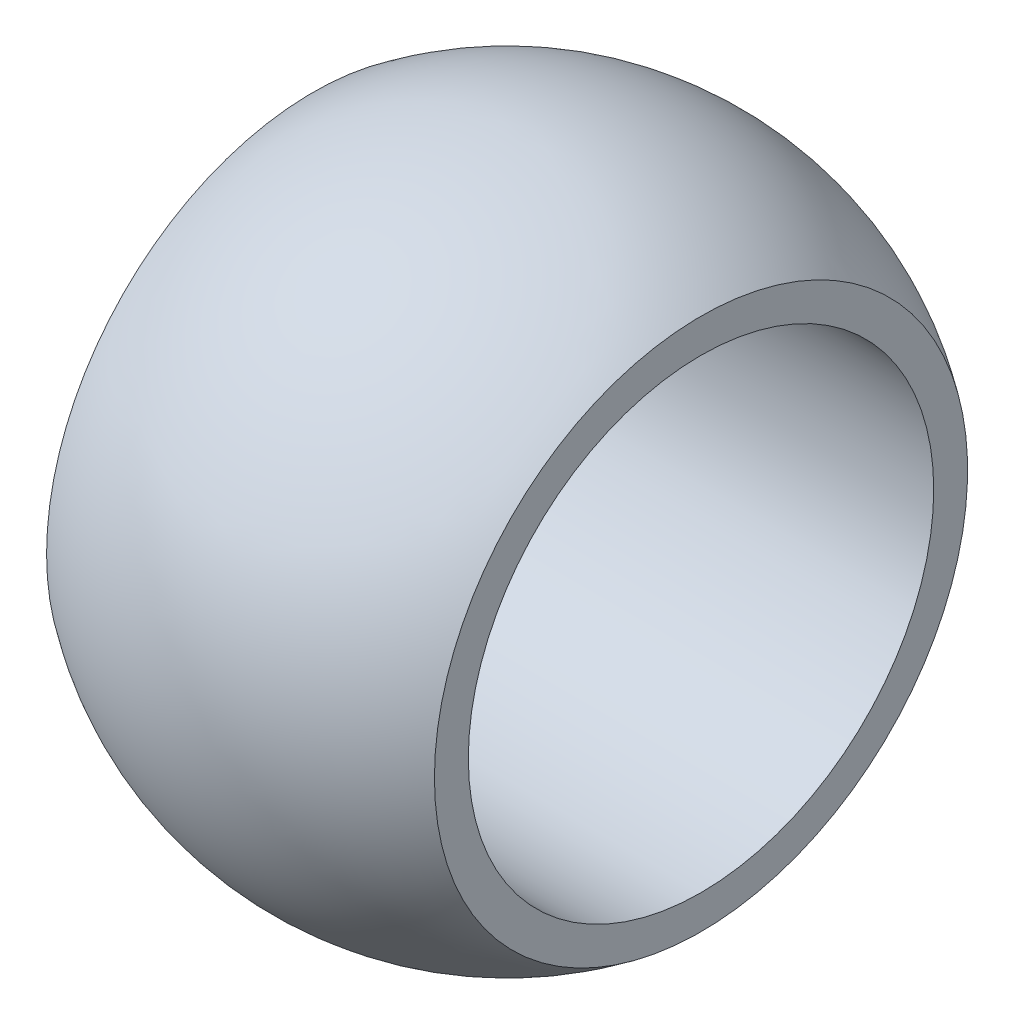
ISO-10303-21;
HEADER;
FILE_DESCRIPTION(('STEP AP214'),'2;1');
FILE_NAME('part.step','',(''),(''),'','','');
FILE_SCHEMA(('AUTOMOTIVE_DESIGN { 1 0 10303 214 1 1 1 1 }'));
ENDSEC;
DATA;
#1=APPLICATION_CONTEXT('core data for automotive mechanical design processes');
#2=APPLICATION_PROTOCOL_DEFINITION('international standard','automotive_design',2000,#1);
#3=PRODUCT_CONTEXT('',#1,'mechanical');
#4=PRODUCT('Part','Part','',(#3));
#5=PRODUCT_RELATED_PRODUCT_CATEGORY('part','',(#4));
#6=PRODUCT_DEFINITION_FORMATION('','',#4);
#7=PRODUCT_DEFINITION_CONTEXT('part definition',#1,'design');
#8=PRODUCT_DEFINITION('design','',#6,#7);
#9=PRODUCT_DEFINITION_SHAPE('','',#8);
#10=(LENGTH_UNIT() NAMED_UNIT(*) SI_UNIT(.MILLI.,.METRE.));
#11=(NAMED_UNIT(*) PLANE_ANGLE_UNIT() SI_UNIT($,.RADIAN.));
#12=(NAMED_UNIT(*) SI_UNIT($,.STERADIAN.) SOLID_ANGLE_UNIT());
#13=UNCERTAINTY_MEASURE_WITH_UNIT(LENGTH_MEASURE(1.E-05),#10,'distance_accuracy_value','');
#14=(GEOMETRIC_REPRESENTATION_CONTEXT(3) GLOBAL_UNCERTAINTY_ASSIGNED_CONTEXT((#13)) GLOBAL_UNIT_ASSIGNED_CONTEXT((#10,
#11,#12)) REPRESENTATION_CONTEXT('',''));
#15=CARTESIAN_POINT('',(0.,0.,0.));
#16=DIRECTION('',(0.,0.,1.));
#17=DIRECTION('',(1.,0.,0.));
#18=AXIS2_PLACEMENT_3D('',#15,#16,#17);
#19=CARTESIAN_POINT('',(0.,0.,0.));
#20=DIRECTION('',(0.,0.,1.));
#21=DIRECTION('',(1.,0.,0.));
#22=AXIS2_PLACEMENT_3D('',#19,#20,#21);
#23=SPHERICAL_SURFACE('',#22,8.5);
#24=CARTESIAN_POINT('',(0.,0.,0.));
#25=DIRECTION('',(-1.,0.,0.));
#26=DIRECTION('',(0.,0.,1.));
#27=AXIS2_PLACEMENT_3D('',#24,#25,#26);
#28=SPHERICAL_SURFACE('',#27,8.5);
#29=CARTESIAN_POINT('',(-5.,0.,0.));
#30=DIRECTION('',(-1.,0.,0.));
#31=DIRECTION('',(0.,0.,1.));
#32=AXIS2_PLACEMENT_3D('',#29,#30,#31);
#33=CIRCLE('',#32,6.87386354243377);
#34=CARTESIAN_POINT('',(-5.,0.,6.87386354243377));
#35=VERTEX_POINT('',#34);
#36=EDGE_CURVE('E10',#35,#35,#33,.T.);
#37=ORIENTED_EDGE('',*,*,#36,.F.);
#38=EDGE_LOOP('',(#37));
#39=FACE_BOUND('',#38,.T.);
#40=CARTESIAN_POINT('',(4.99999999999999,0.,0.));
#41=DIRECTION('',(-1.,0.,0.));
#42=DIRECTION('',(0.,0.,1.));
#43=AXIS2_PLACEMENT_3D('',#40,#41,#42);
#44=CIRCLE('',#43,6.87386354243377);
#45=CARTESIAN_POINT('',(4.99999999999999,0.,6.87386354243377));
#46=VERTEX_POINT('',#45);
#47=EDGE_CURVE('E46',#46,#46,#44,.T.);
#48=ORIENTED_EDGE('',*,*,#47,.T.);
#49=EDGE_LOOP('',(#48));
#50=FACE_BOUND('',#49,.T.);
#51=ADVANCED_FACE('F32',(#39,#50),#28,.T.);
#52=CARTESIAN_POINT('',(-5.00000000000001,6.87386354243377,0.));
#53=DIRECTION('',(1.,0.,0.));
#54=DIRECTION('',(0.,0.,-1.));
#55=AXIS2_PLACEMENT_3D('',#52,#53,#54);
#56=PLANE('',#55);
#57=CARTESIAN_POINT('',(-5.,0.,0.));
#58=DIRECTION('',(-1.,0.,0.));
#59=DIRECTION('',(0.,0.,1.));
#60=AXIS2_PLACEMENT_3D('',#57,#58,#59);
#61=CIRCLE('',#60,6.);
#62=CARTESIAN_POINT('',(-5.,0.,6.));
#63=VERTEX_POINT('',#62);
#64=EDGE_CURVE('E38',#63,#63,#61,.T.);
#65=ORIENTED_EDGE('',*,*,#64,.F.);
#66=EDGE_LOOP('',(#65));
#67=FACE_BOUND('',#66,.T.);
#68=ORIENTED_EDGE('',*,*,#36,.T.);
#69=EDGE_LOOP('',(#68));
#70=FACE_BOUND('',#69,.T.);
#71=ADVANCED_FACE('F61',(#67,#70),#56,.F.);
#72=CARTESIAN_POINT('',(-70.,0.,0.));
#73=DIRECTION('',(-1.,0.,0.));
#74=DIRECTION('',(0.,0.,1.));
#75=AXIS2_PLACEMENT_3D('',#72,#73,#74);
#76=CYLINDRICAL_SURFACE('',#75,6.);
#77=CARTESIAN_POINT('',(4.99999999999999,0.,0.));
#78=DIRECTION('',(-1.,0.,0.));
#79=DIRECTION('',(0.,0.,1.));
#80=AXIS2_PLACEMENT_3D('',#77,#78,#79);
#81=CIRCLE('',#80,6.);
#82=CARTESIAN_POINT('',(4.99999999999999,0.,6.));
#83=VERTEX_POINT('',#82);
#84=EDGE_CURVE('E42',#83,#83,#81,.T.);
#85=ORIENTED_EDGE('',*,*,#84,.F.);
#86=EDGE_LOOP('',(#85));
#87=FACE_BOUND('',#86,.T.);
#88=ORIENTED_EDGE('',*,*,#64,.T.);
#89=EDGE_LOOP('',(#88));
#90=FACE_BOUND('',#89,.T.);
#91=ADVANCED_FACE('F55',(#87,#90),#76,.F.);
#92=CARTESIAN_POINT('',(4.99999999999999,6.87386354243377,0.));
#93=DIRECTION('',(1.,0.,0.));
#94=DIRECTION('',(0.,0.,-1.));
#95=AXIS2_PLACEMENT_3D('',#92,#93,#94);
#96=PLANE('',#95);
#97=ORIENTED_EDGE('',*,*,#84,.T.);
#98=EDGE_LOOP('',(#97));
#99=FACE_BOUND('',#98,.T.);
#100=ORIENTED_EDGE('',*,*,#47,.F.);
#101=EDGE_LOOP('',(#100));
#102=FACE_BOUND('',#101,.T.);
#103=ADVANCED_FACE('F53',(#99,#102),#96,.T.);
#104=CLOSED_SHELL('',(#51,#71,#91,#103));
#105=MANIFOLD_SOLID_BREP('B2',#104);
#106=ADVANCED_BREP_SHAPE_REPRESENTATION('',(#18,#105),#14);
#107=SHAPE_DEFINITION_REPRESENTATION(#9,#106);
ENDSEC;
END-ISO-10303-21;
